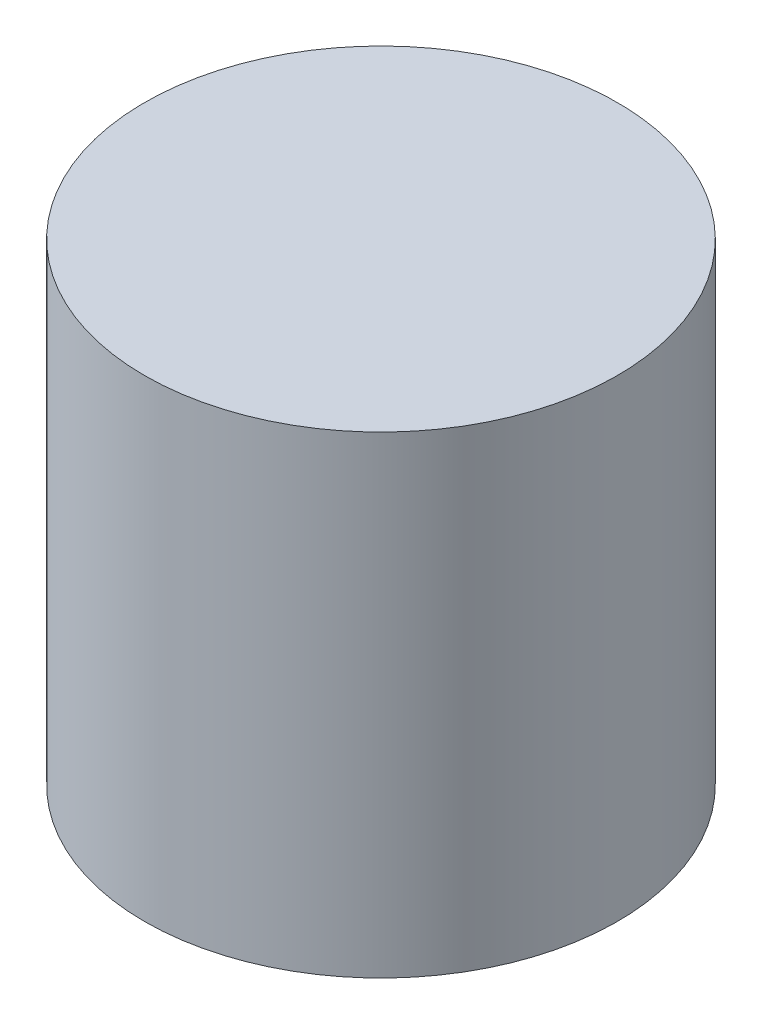
ISO-10303-21;
HEADER;
FILE_DESCRIPTION(('STEP AP214'),'2;1');
FILE_NAME('part.step','',(''),(''),'','','');
FILE_SCHEMA(('AUTOMOTIVE_DESIGN { 1 0 10303 214 1 1 1 1 }'));
ENDSEC;
DATA;
#1=APPLICATION_CONTEXT('core data for automotive mechanical design processes');
#2=APPLICATION_PROTOCOL_DEFINITION('international standard','automotive_design',2000,#1);
#3=PRODUCT_CONTEXT('',#1,'mechanical');
#4=PRODUCT('Part','Part','',(#3));
#5=PRODUCT_RELATED_PRODUCT_CATEGORY('part','',(#4));
#6=PRODUCT_DEFINITION_FORMATION('','',#4);
#7=PRODUCT_DEFINITION_CONTEXT('part definition',#1,'design');
#8=PRODUCT_DEFINITION('design','',#6,#7);
#9=PRODUCT_DEFINITION_SHAPE('','',#8);
#10=(LENGTH_UNIT() NAMED_UNIT(*) SI_UNIT(.MILLI.,.METRE.));
#11=(NAMED_UNIT(*) PLANE_ANGLE_UNIT() SI_UNIT($,.RADIAN.));
#12=(NAMED_UNIT(*) SI_UNIT($,.STERADIAN.) SOLID_ANGLE_UNIT());
#13=UNCERTAINTY_MEASURE_WITH_UNIT(LENGTH_MEASURE(1.E-05),#10,'distance_accuracy_value','');
#14=(GEOMETRIC_REPRESENTATION_CONTEXT(3) GLOBAL_UNCERTAINTY_ASSIGNED_CONTEXT((#13)) GLOBAL_UNIT_ASSIGNED_CONTEXT((#10,
#11,#12)) REPRESENTATION_CONTEXT('',''));
#15=CARTESIAN_POINT('',(0.,0.,0.));
#16=DIRECTION('',(0.,0.,1.));
#17=DIRECTION('',(1.,0.,0.));
#18=AXIS2_PLACEMENT_3D('',#15,#16,#17);
#19=CARTESIAN_POINT('',(0.,1.27,0.));
#20=DIRECTION('',(0.,-1.,0.));
#21=DIRECTION('',(0.,0.,-1.));
#22=AXIS2_PLACEMENT_3D('',#19,#20,#21);
#23=CYLINDRICAL_SURFACE('',#22,0.635);
#24=CARTESIAN_POINT('',(0.,1.27,0.));
#25=DIRECTION('',(0.,1.,0.));
#26=DIRECTION('',(0.,0.,1.));
#27=AXIS2_PLACEMENT_3D('',#24,#25,#26);
#28=CIRCLE('',#27,0.635);
#29=CARTESIAN_POINT('',(0.,1.27,0.635));
#30=VERTEX_POINT('',#29);
#31=EDGE_CURVE('E10',#30,#30,#28,.T.);
#32=ORIENTED_EDGE('',*,*,#31,.F.);
#33=EDGE_LOOP('',(#32));
#34=FACE_BOUND('',#33,.T.);
#35=CARTESIAN_POINT('',(0.,0.,0.));
#36=DIRECTION('',(0.,1.,0.));
#37=DIRECTION('',(0.,0.,1.));
#38=AXIS2_PLACEMENT_3D('',#35,#36,#37);
#39=CIRCLE('',#38,0.635);
#40=CARTESIAN_POINT('',(0.,0.,0.635));
#41=VERTEX_POINT('',#40);
#42=EDGE_CURVE('E36',#41,#41,#39,.T.);
#43=ORIENTED_EDGE('',*,*,#42,.T.);
#44=EDGE_LOOP('',(#43));
#45=FACE_BOUND('',#44,.T.);
#46=ADVANCED_FACE('F33',(#34,#45),#23,.T.);
#47=CARTESIAN_POINT('',(0.,1.27,0.));
#48=DIRECTION('',(0.,1.,0.));
#49=DIRECTION('',(0.,0.,1.));
#50=AXIS2_PLACEMENT_3D('',#47,#48,#49);
#51=PLANE('',#50);
#52=ORIENTED_EDGE('',*,*,#31,.T.);
#53=EDGE_LOOP('',(#52));
#54=FACE_BOUND('',#53,.T.);
#55=ADVANCED_FACE('F48',(#54),#51,.T.);
#56=CARTESIAN_POINT('',(0.,0.,0.));
#57=DIRECTION('',(0.,1.,0.));
#58=DIRECTION('',(0.,0.,1.));
#59=AXIS2_PLACEMENT_3D('',#56,#57,#58);
#60=PLANE('',#59);
#61=ORIENTED_EDGE('',*,*,#42,.F.);
#62=EDGE_LOOP('',(#61));
#63=FACE_BOUND('',#62,.T.);
#64=ADVANCED_FACE('F46',(#63),#60,.F.);
#65=CLOSED_SHELL('',(#46,#55,#64));
#66=MANIFOLD_SOLID_BREP('B2',#65);
#67=ADVANCED_BREP_SHAPE_REPRESENTATION('',(#18,#66),#14);
#68=SHAPE_DEFINITION_REPRESENTATION(#9,#67);
ENDSEC;
END-ISO-10303-21;
